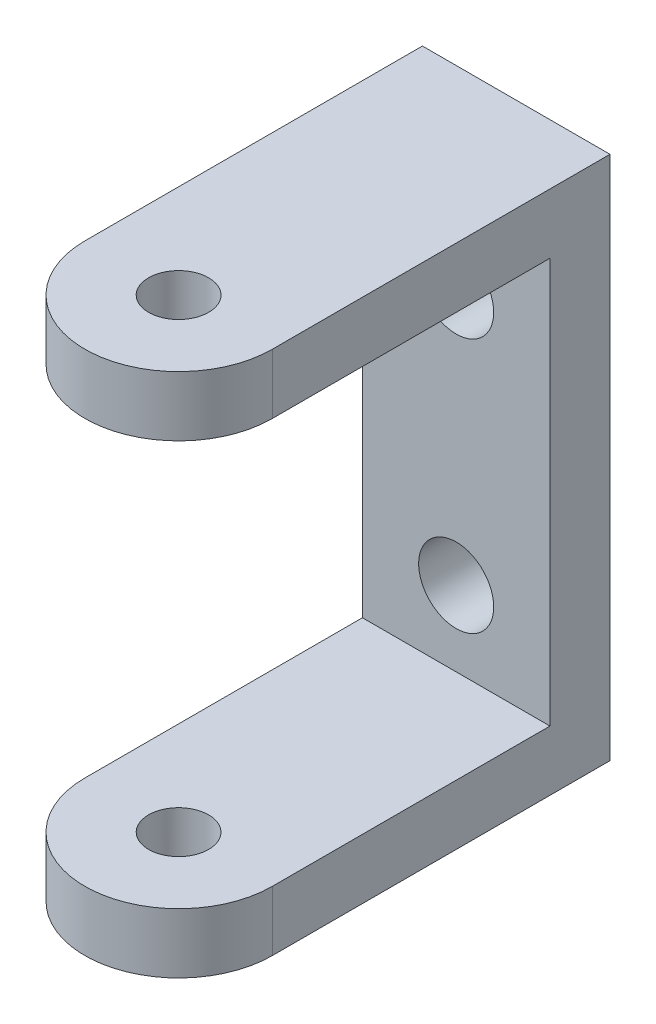
ISO-10303-21;
HEADER;
FILE_DESCRIPTION(('STEP AP214'),'2;1');
FILE_NAME('part.step','',(''),(''),'','','');
FILE_SCHEMA(('AUTOMOTIVE_DESIGN { 1 0 10303 214 1 1 1 1 }'));
ENDSEC;
DATA;
#1=APPLICATION_CONTEXT('core data for automotive mechanical design processes');
#2=APPLICATION_PROTOCOL_DEFINITION('international standard','automotive_design',2000,#1);
#3=PRODUCT_CONTEXT('',#1,'mechanical');
#4=PRODUCT('Part','Part','',(#3));
#5=PRODUCT_RELATED_PRODUCT_CATEGORY('part','',(#4));
#6=PRODUCT_DEFINITION_FORMATION('','',#4);
#7=PRODUCT_DEFINITION_CONTEXT('part definition',#1,'design');
#8=PRODUCT_DEFINITION('design','',#6,#7);
#9=PRODUCT_DEFINITION_SHAPE('','',#8);
#10=(LENGTH_UNIT() NAMED_UNIT(*) SI_UNIT(.MILLI.,.METRE.));
#11=(NAMED_UNIT(*) PLANE_ANGLE_UNIT() SI_UNIT($,.RADIAN.));
#12=(NAMED_UNIT(*) SI_UNIT($,.STERADIAN.) SOLID_ANGLE_UNIT());
#13=UNCERTAINTY_MEASURE_WITH_UNIT(LENGTH_MEASURE(1.E-05),#10,'distance_accuracy_value','');
#14=(GEOMETRIC_REPRESENTATION_CONTEXT(3) GLOBAL_UNCERTAINTY_ASSIGNED_CONTEXT((#13)) GLOBAL_UNIT_ASSIGNED_CONTEXT((#10,
#11,#12)) REPRESENTATION_CONTEXT('',''));
#15=CARTESIAN_POINT('',(0.,0.,0.));
#16=DIRECTION('',(0.,0.,1.));
#17=DIRECTION('',(1.,0.,0.));
#18=AXIS2_PLACEMENT_3D('',#15,#16,#17);
#19=CARTESIAN_POINT('',(12.5,-35.,8.));
#20=DIRECTION('',(0.,1.,0.));
#21=DIRECTION('',(-1.,0.,0.));
#22=AXIS2_PLACEMENT_3D('',#19,#20,#21);
#23=PLANE('',#22);
#24=CARTESIAN_POINT('',(0.,-35.,45.));
#25=DIRECTION('',(0.,1.,0.));
#26=DIRECTION('',(-1.,0.,0.));
#27=AXIS2_PLACEMENT_3D('',#24,#25,#26);
#28=CIRCLE('',#27,4.);
#29=CARTESIAN_POINT('',(-3.99999999999998,-35.,45.));
#30=VERTEX_POINT('',#29);
#31=EDGE_CURVE('E246',#30,#30,#28,.T.);
#32=ORIENTED_EDGE('',*,*,#31,.T.);
#33=EDGE_LOOP('',(#32));
#34=FACE_BOUND('',#33,.T.);
#35=CARTESIAN_POINT('',(0.,-35.,45.));
#36=DIRECTION('',(0.,1.,0.));
#37=DIRECTION('',(-1.,0.,0.));
#38=AXIS2_PLACEMENT_3D('',#35,#36,#37);
#39=CIRCLE('',#38,12.5);
#40=CARTESIAN_POINT('',(-12.5,-35.,45.));
#41=VERTEX_POINT('',#40);
#42=CARTESIAN_POINT('',(12.5,-35.,45.));
#43=VERTEX_POINT('',#42);
#44=EDGE_CURVE('E159',#41,#43,#39,.T.);
#45=ORIENTED_EDGE('',*,*,#44,.F.);
#46=DIRECTION('',(0.,0.,-1.));
#47=VECTOR('',#46,1.);
#48=CARTESIAN_POINT('',(-12.5,-35.,8.));
#49=LINE('',#48,#47);
#50=CARTESIAN_POINT('',(-12.5,-35.,0.));
#51=VERTEX_POINT('',#50);
#52=EDGE_CURVE('E12',#41,#51,#49,.T.);
#53=ORIENTED_EDGE('',*,*,#52,.T.);
#54=DIRECTION('',(1.,0.,0.));
#55=VECTOR('',#54,1.);
#56=CARTESIAN_POINT('',(12.5,-35.,0.));
#57=LINE('',#56,#55);
#58=CARTESIAN_POINT('',(12.5,-35.,0.));
#59=VERTEX_POINT('',#58);
#60=EDGE_CURVE('E201',#51,#59,#57,.T.);
#61=ORIENTED_EDGE('',*,*,#60,.T.);
#62=DIRECTION('',(0.,0.,-1.));
#63=VECTOR('',#62,1.);
#64=CARTESIAN_POINT('',(12.5,-35.,8.));
#65=LINE('',#64,#63);
#66=EDGE_CURVE('E90',#43,#59,#65,.T.);
#67=ORIENTED_EDGE('',*,*,#66,.F.);
#68=EDGE_LOOP('',(#45,#53,#61,#67));
#69=FACE_BOUND('',#68,.T.);
#70=ADVANCED_FACE('F80',(#34,#69),#23,.F.);
#71=CARTESIAN_POINT('',(12.5,35.,8.));
#72=DIRECTION('',(0.,-1.,0.));
#73=DIRECTION('',(1.,0.,0.));
#74=AXIS2_PLACEMENT_3D('',#71,#72,#73);
#75=PLANE('',#74);
#76=CARTESIAN_POINT('',(0.,35.,45.));
#77=DIRECTION('',(0.,1.,0.));
#78=DIRECTION('',(-1.,0.,0.));
#79=AXIS2_PLACEMENT_3D('',#76,#77,#78);
#80=CIRCLE('',#79,4.);
#81=CARTESIAN_POINT('',(-4.,35.,45.));
#82=VERTEX_POINT('',#81);
#83=EDGE_CURVE('E170',#82,#82,#80,.T.);
#84=ORIENTED_EDGE('',*,*,#83,.F.);
#85=EDGE_LOOP('',(#84));
#86=FACE_BOUND('',#85,.T.);
#87=DIRECTION('',(0.,0.,-1.));
#88=VECTOR('',#87,1.);
#89=CARTESIAN_POINT('',(-12.5,35.,8.));
#90=LINE('',#89,#88);
#91=CARTESIAN_POINT('',(-12.5,35.,45.));
#92=VERTEX_POINT('',#91);
#93=CARTESIAN_POINT('',(-12.5,35.,0.));
#94=VERTEX_POINT('',#93);
#95=EDGE_CURVE('E165',#92,#94,#90,.T.);
#96=ORIENTED_EDGE('',*,*,#95,.F.);
#97=CARTESIAN_POINT('',(0.,35.,45.));
#98=DIRECTION('',(0.,1.,0.));
#99=DIRECTION('',(-1.,0.,0.));
#100=AXIS2_PLACEMENT_3D('',#97,#98,#99);
#101=CIRCLE('',#100,12.5);
#102=CARTESIAN_POINT('',(12.5,35.,45.));
#103=VERTEX_POINT('',#102);
#104=EDGE_CURVE('E149',#92,#103,#101,.T.);
#105=ORIENTED_EDGE('',*,*,#104,.T.);
#106=DIRECTION('',(0.,0.,-1.));
#107=VECTOR('',#106,1.);
#108=CARTESIAN_POINT('',(12.5,35.,8.));
#109=LINE('',#108,#107);
#110=CARTESIAN_POINT('',(12.5,35.,0.));
#111=VERTEX_POINT('',#110);
#112=EDGE_CURVE('E177',#103,#111,#109,.T.);
#113=ORIENTED_EDGE('',*,*,#112,.T.);
#114=DIRECTION('',(-1.,0.,0.));
#115=VECTOR('',#114,1.);
#116=CARTESIAN_POINT('',(12.5,35.,0.));
#117=LINE('',#116,#115);
#118=EDGE_CURVE('E174',#111,#94,#117,.T.);
#119=ORIENTED_EDGE('',*,*,#118,.T.);
#120=EDGE_LOOP('',(#96,#105,#113,#119));
#121=FACE_BOUND('',#120,.T.);
#122=ADVANCED_FACE('F172',(#86,#121),#75,.F.);
#123=CARTESIAN_POINT('',(-12.5,27.,57.5));
#124=DIRECTION('',(0.,1.,0.));
#125=DIRECTION('',(0.,0.,1.));
#126=AXIS2_PLACEMENT_3D('',#123,#124,#125);
#127=PLANE('',#126);
#128=CARTESIAN_POINT('',(0.,27.,45.));
#129=DIRECTION('',(0.,1.,0.));
#130=DIRECTION('',(0.,0.,1.));
#131=AXIS2_PLACEMENT_3D('',#128,#129,#130);
#132=CIRCLE('',#131,4.);
#133=CARTESIAN_POINT('',(0.,27.,49.));
#134=VERTEX_POINT('',#133);
#135=EDGE_CURVE('E160',#134,#134,#132,.T.);
#136=ORIENTED_EDGE('',*,*,#135,.T.);
#137=EDGE_LOOP('',(#136));
#138=FACE_BOUND('',#137,.T.);
#139=CARTESIAN_POINT('',(0.,27.,45.));
#140=DIRECTION('',(0.,1.,0.));
#141=DIRECTION('',(0.,0.,1.));
#142=AXIS2_PLACEMENT_3D('',#139,#140,#141);
#143=CIRCLE('',#142,12.5);
#144=CARTESIAN_POINT('',(-12.5,27.,45.));
#145=VERTEX_POINT('',#144);
#146=CARTESIAN_POINT('',(12.5,27.,45.));
#147=VERTEX_POINT('',#146);
#148=EDGE_CURVE('E231',#145,#147,#143,.T.);
#149=ORIENTED_EDGE('',*,*,#148,.F.);
#150=DIRECTION('',(0.,0.,-1.));
#151=VECTOR('',#150,1.);
#152=CARTESIAN_POINT('',(-12.5,27.,57.5));
#153=LINE('',#152,#151);
#154=CARTESIAN_POINT('',(-12.5,27.,8.));
#155=VERTEX_POINT('',#154);
#156=EDGE_CURVE('E105',#145,#155,#153,.T.);
#157=ORIENTED_EDGE('',*,*,#156,.T.);
#158=DIRECTION('',(1.,0.,0.));
#159=VECTOR('',#158,1.);
#160=CARTESIAN_POINT('',(-12.5,27.,8.));
#161=LINE('',#160,#159);
#162=CARTESIAN_POINT('',(12.5,27.,8.));
#163=VERTEX_POINT('',#162);
#164=EDGE_CURVE('E220',#155,#163,#161,.T.);
#165=ORIENTED_EDGE('',*,*,#164,.T.);
#166=DIRECTION('',(0.,0.,-1.));
#167=VECTOR('',#166,1.);
#168=CARTESIAN_POINT('',(12.5,27.,57.5));
#169=LINE('',#168,#167);
#170=EDGE_CURVE('E217',#147,#163,#169,.T.);
#171=ORIENTED_EDGE('',*,*,#170,.F.);
#172=EDGE_LOOP('',(#149,#157,#165,#171));
#173=FACE_BOUND('',#172,.T.);
#174=ADVANCED_FACE('F290',(#138,#173),#127,.F.);
#175=CARTESIAN_POINT('',(-12.5,-27.,57.5));
#176=DIRECTION('',(0.,-1.,0.));
#177=DIRECTION('',(0.,0.,-1.));
#178=AXIS2_PLACEMENT_3D('',#175,#176,#177);
#179=PLANE('',#178);
#180=CARTESIAN_POINT('',(0.,-27.,45.));
#181=DIRECTION('',(0.,-1.,0.));
#182=DIRECTION('',(0.,0.,-1.));
#183=AXIS2_PLACEMENT_3D('',#180,#181,#182);
#184=CIRCLE('',#183,4.);
#185=CARTESIAN_POINT('',(0.,-27.,41.));
#186=VERTEX_POINT('',#185);
#187=EDGE_CURVE('E84',#186,#186,#184,.T.);
#188=ORIENTED_EDGE('',*,*,#187,.T.);
#189=EDGE_LOOP('',(#188));
#190=FACE_BOUND('',#189,.T.);
#191=DIRECTION('',(0.,0.,-1.));
#192=VECTOR('',#191,1.);
#193=CARTESIAN_POINT('',(-12.5,-27.,57.5));
#194=LINE('',#193,#192);
#195=CARTESIAN_POINT('',(-12.5,-27.,45.));
#196=VERTEX_POINT('',#195);
#197=CARTESIAN_POINT('',(-12.5,-27.,8.));
#198=VERTEX_POINT('',#197);
#199=EDGE_CURVE('E225',#196,#198,#194,.T.);
#200=ORIENTED_EDGE('',*,*,#199,.F.);
#201=CARTESIAN_POINT('',(0.,-27.,45.));
#202=DIRECTION('',(0.,-1.,0.));
#203=DIRECTION('',(0.,0.,-1.));
#204=AXIS2_PLACEMENT_3D('',#201,#202,#203);
#205=CIRCLE('',#204,12.5);
#206=CARTESIAN_POINT('',(12.5,-27.,45.));
#207=VERTEX_POINT('',#206);
#208=EDGE_CURVE('E234',#207,#196,#205,.T.);
#209=ORIENTED_EDGE('',*,*,#208,.F.);
#210=DIRECTION('',(0.,0.,-1.));
#211=VECTOR('',#210,1.);
#212=CARTESIAN_POINT('',(12.5,-27.,57.5));
#213=LINE('',#212,#211);
#214=CARTESIAN_POINT('',(12.5,-27.,8.));
#215=VERTEX_POINT('',#214);
#216=EDGE_CURVE('E97',#207,#215,#213,.T.);
#217=ORIENTED_EDGE('',*,*,#216,.T.);
#218=DIRECTION('',(-1.,0.,0.));
#219=VECTOR('',#218,1.);
#220=CARTESIAN_POINT('',(-12.5,-27.,8.));
#221=LINE('',#220,#219);
#222=EDGE_CURVE('E228',#215,#198,#221,.T.);
#223=ORIENTED_EDGE('',*,*,#222,.T.);
#224=EDGE_LOOP('',(#200,#209,#217,#223));
#225=FACE_BOUND('',#224,.T.);
#226=ADVANCED_FACE('F288',(#190,#225),#179,.F.);
#227=CARTESIAN_POINT('',(12.5,-35.,8.));
#228=DIRECTION('',(-1.,0.,0.));
#229=DIRECTION('',(0.,0.,1.));
#230=AXIS2_PLACEMENT_3D('',#227,#228,#229);
#231=PLANE('',#230);
#232=DIRECTION('',(0.,1.,0.));
#233=VECTOR('',#232,1.);
#234=CARTESIAN_POINT('',(12.5,-35.,45.));
#235=LINE('',#234,#233);
#236=EDGE_CURVE('E198',#43,#207,#235,.T.);
#237=ORIENTED_EDGE('',*,*,#236,.F.);
#238=ORIENTED_EDGE('',*,*,#66,.T.);
#239=DIRECTION('',(0.,1.,0.));
#240=VECTOR('',#239,1.);
#241=CARTESIAN_POINT('',(12.5,-35.,0.));
#242=LINE('',#241,#240);
#243=EDGE_CURVE('E197',#59,#111,#242,.T.);
#244=ORIENTED_EDGE('',*,*,#243,.T.);
#245=ORIENTED_EDGE('',*,*,#112,.F.);
#246=EDGE_CURVE('E154',#147,#103,#235,.T.);
#247=ORIENTED_EDGE('',*,*,#246,.F.);
#248=ORIENTED_EDGE('',*,*,#170,.T.);
#249=DIRECTION('',(0.,1.,0.));
#250=VECTOR('',#249,1.);
#251=CARTESIAN_POINT('',(12.5,-35.,8.));
#252=LINE('',#251,#250);
#253=EDGE_CURVE('E178',#215,#163,#252,.T.);
#254=ORIENTED_EDGE('',*,*,#253,.F.);
#255=ORIENTED_EDGE('',*,*,#216,.F.);
#256=EDGE_LOOP('',(#237,#238,#244,#245,#247,#248,#254,#255));
#257=FACE_BOUND('',#256,.T.);
#258=ADVANCED_FACE('F195',(#257),#231,.F.);
#259=CARTESIAN_POINT('',(0.,0.,8.));
#260=DIRECTION('',(0.,0.,1.));
#261=DIRECTION('',(1.,0.,0.));
#262=AXIS2_PLACEMENT_3D('',#259,#260,#261);
#263=PLANE('',#262);
#264=CARTESIAN_POINT('',(0.,17.,8.));
#265=DIRECTION('',(0.,0.,1.));
#266=DIRECTION('',(1.,0.,0.));
#267=AXIS2_PLACEMENT_3D('',#264,#265,#266);
#268=CIRCLE('',#267,5.);
#269=CARTESIAN_POINT('',(5.,17.,8.));
#270=VERTEX_POINT('',#269);
#271=EDGE_CURVE('E262',#270,#270,#268,.T.);
#272=ORIENTED_EDGE('',*,*,#271,.F.);
#273=EDGE_LOOP('',(#272));
#274=FACE_BOUND('',#273,.T.);
#275=CARTESIAN_POINT('',(0.,-17.,8.));
#276=DIRECTION('',(0.,0.,1.));
#277=DIRECTION('',(1.,0.,0.));
#278=AXIS2_PLACEMENT_3D('',#275,#276,#277);
#279=CIRCLE('',#278,5.);
#280=CARTESIAN_POINT('',(5.,-17.,8.));
#281=VERTEX_POINT('',#280);
#282=EDGE_CURVE('E254',#281,#281,#279,.T.);
#283=ORIENTED_EDGE('',*,*,#282,.F.);
#284=EDGE_LOOP('',(#283));
#285=FACE_BOUND('',#284,.T.);
#286=DIRECTION('',(0.,-1.,0.));
#287=VECTOR('',#286,1.);
#288=CARTESIAN_POINT('',(-12.5,-35.,8.));
#289=LINE('',#288,#287);
#290=EDGE_CURVE('E184',#155,#198,#289,.T.);
#291=ORIENTED_EDGE('',*,*,#290,.T.);
#292=ORIENTED_EDGE('',*,*,#222,.F.);
#293=ORIENTED_EDGE('',*,*,#253,.T.);
#294=ORIENTED_EDGE('',*,*,#164,.F.);
#295=EDGE_LOOP('',(#291,#292,#293,#294));
#296=FACE_BOUND('',#295,.T.);
#297=ADVANCED_FACE('F279',(#274,#285,#296),#263,.T.);
#298=CARTESIAN_POINT('',(-12.5,-35.,8.));
#299=DIRECTION('',(1.,0.,0.));
#300=DIRECTION('',(0.,0.,-1.));
#301=AXIS2_PLACEMENT_3D('',#298,#299,#300);
#302=PLANE('',#301);
#303=ORIENTED_EDGE('',*,*,#52,.F.);
#304=DIRECTION('',(0.,1.,0.));
#305=VECTOR('',#304,1.);
#306=CARTESIAN_POINT('',(-12.5,-35.,45.));
#307=LINE('',#306,#305);
#308=EDGE_CURVE('E169',#41,#196,#307,.T.);
#309=ORIENTED_EDGE('',*,*,#308,.T.);
#310=ORIENTED_EDGE('',*,*,#199,.T.);
#311=ORIENTED_EDGE('',*,*,#290,.F.);
#312=ORIENTED_EDGE('',*,*,#156,.F.);
#313=EDGE_CURVE('E152',#145,#92,#307,.T.);
#314=ORIENTED_EDGE('',*,*,#313,.T.);
#315=ORIENTED_EDGE('',*,*,#95,.T.);
#316=DIRECTION('',(0.,-1.,0.));
#317=VECTOR('',#316,1.);
#318=CARTESIAN_POINT('',(-12.5,-35.,0.));
#319=LINE('',#318,#317);
#320=EDGE_CURVE('E204',#94,#51,#319,.T.);
#321=ORIENTED_EDGE('',*,*,#320,.T.);
#322=EDGE_LOOP('',(#303,#309,#310,#311,#312,#314,#315,#321));
#323=FACE_BOUND('',#322,.T.);
#324=ADVANCED_FACE('F82',(#323),#302,.F.);
#325=CARTESIAN_POINT('',(0.,0.,0.));
#326=DIRECTION('',(0.,0.,1.));
#327=DIRECTION('',(1.,0.,0.));
#328=AXIS2_PLACEMENT_3D('',#325,#326,#327);
#329=PLANE('',#328);
#330=CARTESIAN_POINT('',(0.,17.,0.));
#331=DIRECTION('',(0.,0.,1.));
#332=DIRECTION('',(1.,0.,0.));
#333=AXIS2_PLACEMENT_3D('',#330,#331,#332);
#334=CIRCLE('',#333,5.);
#335=CARTESIAN_POINT('',(5.,17.,0.));
#336=VERTEX_POINT('',#335);
#337=EDGE_CURVE('E250',#336,#336,#334,.T.);
#338=ORIENTED_EDGE('',*,*,#337,.T.);
#339=EDGE_LOOP('',(#338));
#340=FACE_BOUND('',#339,.T.);
#341=CARTESIAN_POINT('',(0.,-17.,0.));
#342=DIRECTION('',(0.,0.,1.));
#343=DIRECTION('',(1.,0.,0.));
#344=AXIS2_PLACEMENT_3D('',#341,#342,#343);
#345=CIRCLE('',#344,5.);
#346=CARTESIAN_POINT('',(5.,-17.,0.));
#347=VERTEX_POINT('',#346);
#348=EDGE_CURVE('E258',#347,#347,#345,.T.);
#349=ORIENTED_EDGE('',*,*,#348,.T.);
#350=EDGE_LOOP('',(#349));
#351=FACE_BOUND('',#350,.T.);
#352=ORIENTED_EDGE('',*,*,#320,.F.);
#353=ORIENTED_EDGE('',*,*,#118,.F.);
#354=ORIENTED_EDGE('',*,*,#243,.F.);
#355=ORIENTED_EDGE('',*,*,#60,.F.);
#356=EDGE_LOOP('',(#352,#353,#354,#355));
#357=FACE_BOUND('',#356,.T.);
#358=ADVANCED_FACE('F206',(#340,#351,#357),#329,.F.);
#359=CARTESIAN_POINT('',(0.,-35.,45.));
#360=DIRECTION('',(0.,1.,0.));
#361=DIRECTION('',(-1.,0.,0.));
#362=AXIS2_PLACEMENT_3D('',#359,#360,#361);
#363=CYLINDRICAL_SURFACE('',#362,12.5);
#364=ORIENTED_EDGE('',*,*,#208,.T.);
#365=ORIENTED_EDGE('',*,*,#308,.F.);
#366=ORIENTED_EDGE('',*,*,#44,.T.);
#367=ORIENTED_EDGE('',*,*,#236,.T.);
#368=EDGE_LOOP('',(#364,#365,#366,#367));
#369=FACE_BOUND('',#368,.T.);
#370=ADVANCED_FACE('F311',(#369),#363,.T.);
#371=ORIENTED_EDGE('',*,*,#148,.T.);
#372=ORIENTED_EDGE('',*,*,#246,.T.);
#373=ORIENTED_EDGE('',*,*,#104,.F.);
#374=ORIENTED_EDGE('',*,*,#313,.F.);
#375=EDGE_LOOP('',(#371,#372,#373,#374));
#376=FACE_BOUND('',#375,.T.);
#377=ADVANCED_FACE('F151',(#376),#363,.T.);
#378=CARTESIAN_POINT('',(0.,-35.,45.));
#379=DIRECTION('',(0.,1.,0.));
#380=DIRECTION('',(-1.,0.,0.));
#381=AXIS2_PLACEMENT_3D('',#378,#379,#380);
#382=CYLINDRICAL_SURFACE('',#381,4.);
#383=ORIENTED_EDGE('',*,*,#31,.F.);
#384=EDGE_LOOP('',(#383));
#385=FACE_BOUND('',#384,.T.);
#386=ORIENTED_EDGE('',*,*,#187,.F.);
#387=EDGE_LOOP('',(#386));
#388=FACE_BOUND('',#387,.T.);
#389=ADVANCED_FACE('F371',(#385,#388),#382,.F.);
#390=ORIENTED_EDGE('',*,*,#83,.T.);
#391=EDGE_LOOP('',(#390));
#392=FACE_BOUND('',#391,.T.);
#393=ORIENTED_EDGE('',*,*,#135,.F.);
#394=EDGE_LOOP('',(#393));
#395=FACE_BOUND('',#394,.T.);
#396=ADVANCED_FACE('F381',(#392,#395),#382,.F.);
#397=CARTESIAN_POINT('',(0.,-17.,0.));
#398=DIRECTION('',(0.,0.,1.));
#399=DIRECTION('',(1.,0.,0.));
#400=AXIS2_PLACEMENT_3D('',#397,#398,#399);
#401=CYLINDRICAL_SURFACE('',#400,5.);
#402=ORIENTED_EDGE('',*,*,#348,.F.);
#403=EDGE_LOOP('',(#402));
#404=FACE_BOUND('',#403,.T.);
#405=ORIENTED_EDGE('',*,*,#282,.T.);
#406=EDGE_LOOP('',(#405));
#407=FACE_BOUND('',#406,.T.);
#408=ADVANCED_FACE('F275',(#404,#407),#401,.F.);
#409=CARTESIAN_POINT('',(0.,17.,0.));
#410=DIRECTION('',(0.,0.,1.));
#411=DIRECTION('',(1.,0.,0.));
#412=AXIS2_PLACEMENT_3D('',#409,#410,#411);
#413=CYLINDRICAL_SURFACE('',#412,5.);
#414=ORIENTED_EDGE('',*,*,#337,.F.);
#415=EDGE_LOOP('',(#414));
#416=FACE_BOUND('',#415,.T.);
#417=ORIENTED_EDGE('',*,*,#271,.T.);
#418=EDGE_LOOP('',(#417));
#419=FACE_BOUND('',#418,.T.);
#420=ADVANCED_FACE('F272',(#416,#419),#413,.F.);
#421=CLOSED_SHELL('',(#70,#122,#174,#226,#258,#297,#324,#358,#370,#377,#389,#396,#408,#420));
#422=MANIFOLD_SOLID_BREP('B2',#421);
#423=ADVANCED_BREP_SHAPE_REPRESENTATION('',(#18,#422),#14);
#424=SHAPE_DEFINITION_REPRESENTATION(#9,#423);
ENDSEC;
END-ISO-10303-21;
